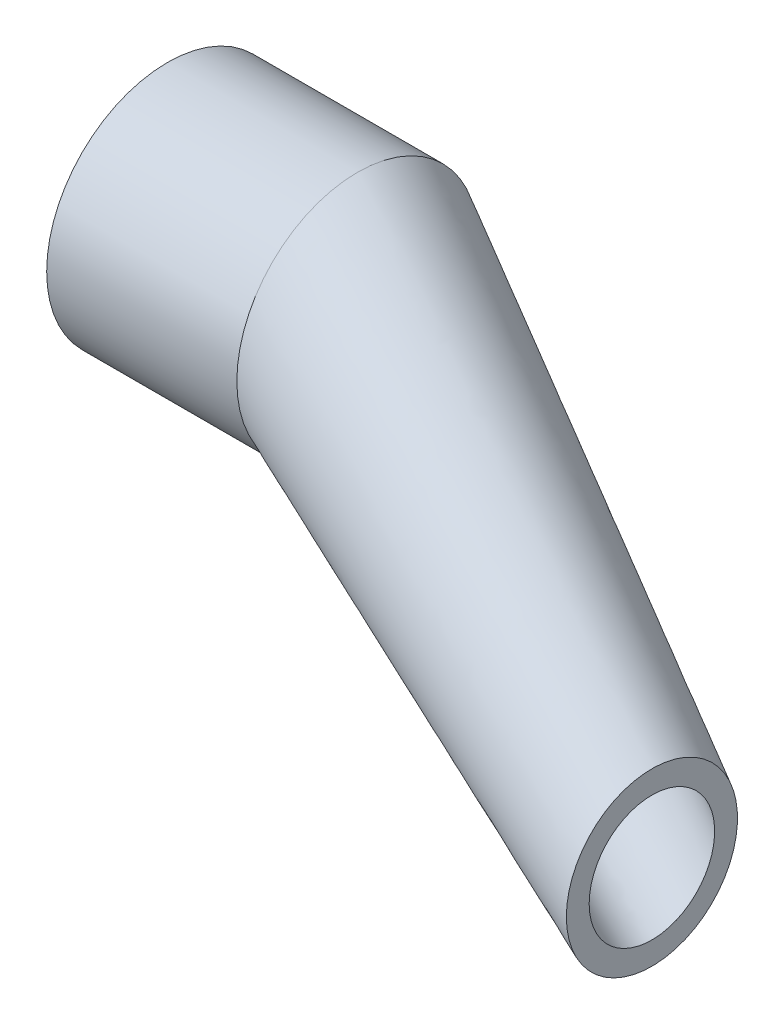
ISO-10303-21;
HEADER;
FILE_DESCRIPTION(('STEP AP214'),'2;1');
FILE_NAME('part.step','',(''),(''),'','','');
FILE_SCHEMA(('AUTOMOTIVE_DESIGN { 1 0 10303 214 1 1 1 1 }'));
ENDSEC;
DATA;
#1=APPLICATION_CONTEXT('core data for automotive mechanical design processes');
#2=APPLICATION_PROTOCOL_DEFINITION('international standard','automotive_design',2000,#1);
#3=PRODUCT_CONTEXT('',#1,'mechanical');
#4=PRODUCT('Part','Part','',(#3));
#5=PRODUCT_RELATED_PRODUCT_CATEGORY('part','',(#4));
#6=PRODUCT_DEFINITION_FORMATION('','',#4);
#7=PRODUCT_DEFINITION_CONTEXT('part definition',#1,'design');
#8=PRODUCT_DEFINITION('design','',#6,#7);
#9=PRODUCT_DEFINITION_SHAPE('','',#8);
#10=(LENGTH_UNIT() NAMED_UNIT(*) SI_UNIT(.MILLI.,.METRE.));
#11=(NAMED_UNIT(*) PLANE_ANGLE_UNIT() SI_UNIT($,.RADIAN.));
#12=(NAMED_UNIT(*) SI_UNIT($,.STERADIAN.) SOLID_ANGLE_UNIT());
#13=UNCERTAINTY_MEASURE_WITH_UNIT(LENGTH_MEASURE(1.E-05),#10,'distance_accuracy_value','');
#14=(GEOMETRIC_REPRESENTATION_CONTEXT(3) GLOBAL_UNCERTAINTY_ASSIGNED_CONTEXT((#13)) GLOBAL_UNIT_ASSIGNED_CONTEXT((#10,
#11,#12)) REPRESENTATION_CONTEXT('',''));
#15=CARTESIAN_POINT('',(0.,0.,0.));
#16=DIRECTION('',(0.,0.,1.));
#17=DIRECTION('',(1.,0.,0.));
#18=AXIS2_PLACEMENT_3D('',#15,#16,#17);
#19=CARTESIAN_POINT('',(104.,14.677159484003,-2.583070286594));
#20=CARTESIAN_POINT('',(118.7,12.848733704041,3.627382664695));
#21=CARTESIAN_POINT('',(103.99999999999,13.517186811906,-2.583070286594));
#22=CARTESIAN_POINT('',(118.69999999999,12.051252491976,3.627382664695));
#23=CARTESIAN_POINT('',(104.00000000003,12.357213675965,-3.190433890196));
#24=CARTESIAN_POINT('',(118.70000000004,11.25377096101,3.209820187222));
#25=CARTESIAN_POINT('',(103.99999999989,11.544169245745,-4.405124938168));
#26=CARTESIAN_POINT('',(118.69999999988,10.694802915252,2.374720091732));
#27=CARTESIAN_POINT('',(104.00000000019,11.424939657342,-6.009361118567));
#28=CARTESIAN_POINT('',(118.70000000023,10.612832573184,1.271807717726));
#29=CARTESIAN_POINT('',(103.99999999972,12.194434662155,-7.566481268748));
#30=CARTESIAN_POINT('',(118.69999999967,11.141860389064,0.201287614448));
#31=CARTESIAN_POINT('',(104.00000000029,13.742485070248,-8.5439502377));
#32=CARTESIAN_POINT('',(118.70000000034,12.206145044529,-0.470722301671));
#33=CARTESIAN_POINT('',(103.99999999976,15.611833897766,-8.54395023766));
#34=CARTESIAN_POINT('',(118.69999999972,13.49132236356,-0.470722301677));
#35=CARTESIAN_POINT('',(104.00000000014,17.159884305833,-7.56648126878));
#36=CARTESIAN_POINT('',(118.70000000015,14.555607019002,0.201287614452));
#37=CARTESIAN_POINT('',(103.99999999993,17.929379310682,-6.009361118547));
#38=CARTESIAN_POINT('',(118.69999999993,15.084634834914,1.271807717724));
#39=CARTESIAN_POINT('',(104.00000000002,17.810149722251,-4.405124938177));
#40=CARTESIAN_POINT('',(118.70000000001,15.00266449282,2.374720091734));
#41=CARTESIAN_POINT('',(103.99999999999,16.997105292046,-3.190433890192));
#42=CARTESIAN_POINT('',(118.69999999999,14.443696447076,3.209820187221));
#43=CARTESIAN_POINT('',(104.,15.837132156098,-2.583070286594));
#44=CARTESIAN_POINT('',(118.7,13.646214916105,3.627382664695));
#45=CARTESIAN_POINT('',(104.,14.677159484003,-2.583070286594));
#46=CARTESIAN_POINT('',(118.7,12.848733704041,3.627382664695));
#47=(BOUNDED_SURFACE() B_SPLINE_SURFACE(13,1,((#19,#20),(#21,#22),(#23,#24),(#25,#26),(#27,#28),
(#29,#30),(#31,#32),(#33,#34),(#35,#36),(#37,#38),(#39,#40),(#41,#42),(#43,#44),(#45,#46)),
.UNSPECIFIED.,.T.,.F.,.F.) B_SPLINE_SURFACE_WITH_KNOTS((14,14),(2,2),(0.,6.28318530718),(0.,1.),
.UNSPECIFIED.) GEOMETRIC_REPRESENTATION_ITEM() RATIONAL_B_SPLINE_SURFACE(((1.,1.),(1.,1.),(1.,
1.),(1.,1.),(1.,1.),(1.,1.),(1.,1.),(1.,1.),(1.,1.),(1.,1.),(1.,1.),(1.,1.),(1.,1.),(1.,1.))) REPRESENTATION_ITEM('') SURFACE());
#48=CARTESIAN_POINT('',(104.,14.677159484003,-2.583070286594));
#49=CARTESIAN_POINT('',(118.7,12.848733704041,3.627382664695));
#50=(BOUNDED_CURVE() B_SPLINE_CURVE(1,(#48,#49),.UNSPECIFIED.,.F.,
.F.) B_SPLINE_CURVE_WITH_KNOTS((2,2),(0.,1.),
.UNSPECIFIED.) CURVE() GEOMETRIC_REPRESENTATION_ITEM() RATIONAL_B_SPLINE_CURVE((1.,1.)) REPRESENTATION_ITEM(''));
#51=CARTESIAN_POINT('',(104.,14.677159484003,-2.583070286594));
#52=VERTEX_POINT('',#51);
#53=CARTESIAN_POINT('',(118.7,12.848733704041,3.627382664695));
#54=VERTEX_POINT('',#53);
#55=EDGE_CURVE('E11',#52,#54,#50,.T.);
#56=CARTESIAN_POINT('',(118.7,12.848733704041,1.977382664695));
#57=DIRECTION('',(1.,0.,0.));
#58=DIRECTION('',(0.,0.,1.));
#59=AXIS2_PLACEMENT_3D('',#56,#57,#58);
#60=CIRCLE('',#59,1.65);
#61=EDGE_CURVE('E31',#54,#54,#60,.T.);
#62=CARTESIAN_POINT('',(104.,14.677159484003,-4.983070286594));
#63=DIRECTION('',(1.,0.,0.));
#64=DIRECTION('',(0.,0.,1.));
#65=AXIS2_PLACEMENT_3D('',#62,#63,#64);
#66=CIRCLE('',#65,2.4);
#67=EDGE_CURVE('E169',#52,#52,#66,.T.);
#68=ORIENTED_EDGE('',*,*,#55,.T.);
#69=ORIENTED_EDGE('',*,*,#61,.T.);
#70=ORIENTED_EDGE('',*,*,#55,.F.);
#71=ORIENTED_EDGE('',*,*,#67,.F.);
#72=EDGE_LOOP('',(#68,#69,#70,#71));
#73=FACE_BOUND('',#72,.T.);
#74=ADVANCED_FACE('F17',(#73),#47,.F.);
#75=CARTESIAN_POINT('',(118.7,12.848733704041,1.977382664695));
#76=DIRECTION('',(1.,0.,0.));
#77=DIRECTION('',(0.,1.,0.));
#78=AXIS2_PLACEMENT_3D('',#75,#76,#77);
#79=PLANE('',#78);
#80=ORIENTED_EDGE('',*,*,#61,.F.);
#81=EDGE_LOOP('',(#80));
#82=FACE_BOUND('',#81,.T.);
#83=CARTESIAN_POINT('',(118.7,12.848733704041,1.977382664695));
#84=DIRECTION('',(1.,0.,0.));
#85=DIRECTION('',(0.,0.,1.));
#86=AXIS2_PLACEMENT_3D('',#83,#84,#85);
#87=CIRCLE('',#86,2.25);
#88=CARTESIAN_POINT('',(118.7,12.848733704041,4.227382664695));
#89=VERTEX_POINT('',#88);
#90=EDGE_CURVE('E71',#89,#89,#87,.T.);
#91=ORIENTED_EDGE('',*,*,#90,.T.);
#92=EDGE_LOOP('',(#91));
#93=FACE_BOUND('',#92,.T.);
#94=ADVANCED_FACE('F115',(#82,#93),#79,.T.);
#95=CARTESIAN_POINT('',(99.,14.677159484003,-4.983070286594));
#96=DIRECTION('',(1.,0.,0.));
#97=DIRECTION('',(0.,0.,1.));
#98=AXIS2_PLACEMENT_3D('',#95,#96,#97);
#99=CYLINDRICAL_SURFACE('',#98,2.4);
#100=CARTESIAN_POINT('',(99.,14.677159484003,-2.583070286594));
#101=CARTESIAN_POINT('',(104.,14.677159484003,-2.583070286594));
#102=(BOUNDED_CURVE() B_SPLINE_CURVE(1,(#100,#101),.UNSPECIFIED.,.F.,
.F.) B_SPLINE_CURVE_WITH_KNOTS((2,2),(0.,1.),
.UNSPECIFIED.) CURVE() GEOMETRIC_REPRESENTATION_ITEM() RATIONAL_B_SPLINE_CURVE((1.,1.)) REPRESENTATION_ITEM(''));
#103=CARTESIAN_POINT('',(99.,14.677159484003,-2.583070286594));
#104=VERTEX_POINT('',#103);
#105=EDGE_CURVE('E22',#104,#52,#102,.T.);
#106=ORIENTED_EDGE('',*,*,#105,.T.);
#107=ORIENTED_EDGE('',*,*,#67,.T.);
#108=ORIENTED_EDGE('',*,*,#105,.F.);
#109=CARTESIAN_POINT('',(99.,14.677159484003,-4.983070286594));
#110=DIRECTION('',(1.,0.,0.));
#111=DIRECTION('',(0.,0.,1.));
#112=AXIS2_PLACEMENT_3D('',#109,#110,#111);
#113=CIRCLE('',#112,2.4);
#114=EDGE_CURVE('E73',#104,#104,#113,.T.);
#115=ORIENTED_EDGE('',*,*,#114,.F.);
#116=EDGE_LOOP('',(#106,#107,#108,#115));
#117=FACE_BOUND('',#116,.T.);
#118=ADVANCED_FACE('F112',(#117),#99,.F.);
#119=CARTESIAN_POINT('',(104.,14.677159484003,-1.808070286594));
#120=CARTESIAN_POINT('',(118.7,12.848733704041,4.227382664695));
#121=CARTESIAN_POINT('',(103.99999999999,13.142612303208,-1.808070286594));
#122=CARTESIAN_POINT('',(118.69999999999,11.761259323953,4.227382664695));
#123=CARTESIAN_POINT('',(104.00000000003,11.608064508787,-2.611561720522));
#124=CARTESIAN_POINT('',(118.70000000004,10.673784508997,3.657979286322));
#125=CARTESIAN_POINT('',(103.99999999989,10.532474481304,-4.218496752748));
#126=CARTESIAN_POINT('',(118.69999999988,9.911555355698,2.519206428839));
#127=CARTESIAN_POINT('',(104.00000000019,10.374743671656,-6.340767533039));
#128=CARTESIAN_POINT('',(118.70000000023,9.799777616499,1.015235009733));
#129=CARTESIAN_POINT('',(103.99999999972,11.392721438423,-8.400707731764));
#130=CARTESIAN_POINT('',(118.69999999967,10.521179183633,-0.44456513109));
#131=CARTESIAN_POINT('',(104.00000000029,13.440663124155,-9.693817721875));
#132=CARTESIAN_POINT('',(118.70000000034,11.972476441053,-1.360942289449));
#133=CARTESIAN_POINT('',(103.99999999976,15.913655843859,-9.693817721894));
#134=CARTESIAN_POINT('',(118.69999999972,13.724990967037,-1.360942289441));
#135=CARTESIAN_POINT('',(104.00000000014,17.961597529566,-8.400707731748));
#136=CARTESIAN_POINT('',(118.70000000015,15.17628822443,-0.444565131096));
#137=CARTESIAN_POINT('',(103.99999999993,18.979575296367,-6.34076753305));
#138=CARTESIAN_POINT('',(118.69999999993,15.897689791603,1.015235009738));
#139=CARTESIAN_POINT('',(104.00000000002,18.821844486692,-4.218496752742));
#140=CARTESIAN_POINT('',(118.70000000001,15.785912052372,2.519206428837));
#141=CARTESIAN_POINT('',(103.99999999999,17.746254459223,-2.611561720524));
#142=CARTESIAN_POINT('',(118.69999999999,15.023682899091,3.657979286322));
#143=CARTESIAN_POINT('',(104.,16.211706664797,-1.808070286594));
#144=CARTESIAN_POINT('',(118.7,13.936208084128,4.227382664695));
#145=CARTESIAN_POINT('',(104.,14.677159484003,-1.808070286594));
#146=CARTESIAN_POINT('',(118.7,12.848733704041,4.227382664695));
#147=(BOUNDED_SURFACE() B_SPLINE_SURFACE(13,1,((#119,#120),(#121,#122),(#123,#124),(#125,#126),
(#127,#128),(#129,#130),(#131,#132),(#133,#134),(#135,#136),(#137,#138),(#139,#140),(#141,#142),
(#143,#144),(#145,#146)),.UNSPECIFIED.,.T.,.F.,.F.) B_SPLINE_SURFACE_WITH_KNOTS((14,14),(2,2),
(0.,6.28318530718),(0.,1.),
.UNSPECIFIED.) GEOMETRIC_REPRESENTATION_ITEM() RATIONAL_B_SPLINE_SURFACE(((1.,1.),(1.,1.),(1.,
1.),(1.,1.),(1.,1.),(1.,1.),(1.,1.),(1.,1.),(1.,1.),(1.,1.),(1.,1.),(1.,1.),(1.,1.),(1.,1.))) REPRESENTATION_ITEM('') SURFACE());
#148=CARTESIAN_POINT('',(104.,14.677159484003,-4.983070286594));
#149=DIRECTION('',(1.,0.,0.));
#150=DIRECTION('',(0.,0.,1.));
#151=AXIS2_PLACEMENT_3D('',#148,#149,#150);
#152=CIRCLE('',#151,3.175);
#153=CARTESIAN_POINT('',(104.,14.677159484003,-1.808070286594));
#154=VERTEX_POINT('',#153);
#155=EDGE_CURVE('E69',#154,#154,#152,.T.);
#156=CARTESIAN_POINT('',(104.,14.677159484003,-1.808070286594));
#157=CARTESIAN_POINT('',(118.7,12.848733704041,4.227382664695));
#158=(BOUNDED_CURVE() B_SPLINE_CURVE(1,(#156,#157),.UNSPECIFIED.,.F.,
.F.) B_SPLINE_CURVE_WITH_KNOTS((2,2),(0.,1.),
.UNSPECIFIED.) CURVE() GEOMETRIC_REPRESENTATION_ITEM() RATIONAL_B_SPLINE_CURVE((1.,1.)) REPRESENTATION_ITEM(''));
#159=EDGE_CURVE('E67',#154,#89,#158,.T.);
#160=ORIENTED_EDGE('',*,*,#155,.T.);
#161=ORIENTED_EDGE('',*,*,#159,.T.);
#162=ORIENTED_EDGE('',*,*,#90,.F.);
#163=ORIENTED_EDGE('',*,*,#159,.F.);
#164=EDGE_LOOP('',(#160,#161,#162,#163));
#165=FACE_BOUND('',#164,.T.);
#166=ADVANCED_FACE('F68',(#165),#147,.T.);
#167=CARTESIAN_POINT('',(99.,14.677159484003,-4.983070286594));
#168=DIRECTION('',(1.,0.,0.));
#169=DIRECTION('',(0.,1.,0.));
#170=AXIS2_PLACEMENT_3D('',#167,#168,#169);
#171=PLANE('',#170);
#172=ORIENTED_EDGE('',*,*,#114,.T.);
#173=EDGE_LOOP('',(#172));
#174=FACE_BOUND('',#173,.T.);
#175=CARTESIAN_POINT('',(99.,14.677159484003,-4.983070286594));
#176=DIRECTION('',(1.,0.,0.));
#177=DIRECTION('',(0.,0.,1.));
#178=AXIS2_PLACEMENT_3D('',#175,#176,#177);
#179=CIRCLE('',#178,3.175);
#180=CARTESIAN_POINT('',(99.,14.677159484003,-1.808070286594));
#181=VERTEX_POINT('',#180);
#182=EDGE_CURVE('E84',#181,#181,#179,.T.);
#183=ORIENTED_EDGE('',*,*,#182,.F.);
#184=EDGE_LOOP('',(#183));
#185=FACE_BOUND('',#184,.T.);
#186=ADVANCED_FACE('F102',(#174,#185),#171,.F.);
#187=CARTESIAN_POINT('',(99.,14.677159484003,-4.983070286594));
#188=DIRECTION('',(1.,0.,0.));
#189=DIRECTION('',(0.,0.,1.));
#190=AXIS2_PLACEMENT_3D('',#187,#188,#189);
#191=CYLINDRICAL_SURFACE('',#190,3.175);
#192=ORIENTED_EDGE('',*,*,#182,.T.);
#193=CARTESIAN_POINT('',(99.,14.677159484003,-1.808070286594));
#194=CARTESIAN_POINT('',(104.,14.677159484003,-1.808070286594));
#195=(BOUNDED_CURVE() B_SPLINE_CURVE(1,(#193,#194),.UNSPECIFIED.,.F.,
.F.) B_SPLINE_CURVE_WITH_KNOTS((2,2),(0.,1.),
.UNSPECIFIED.) CURVE() GEOMETRIC_REPRESENTATION_ITEM() RATIONAL_B_SPLINE_CURVE((1.,1.)) REPRESENTATION_ITEM(''));
#196=EDGE_CURVE('E59',#181,#154,#195,.T.);
#197=ORIENTED_EDGE('',*,*,#196,.T.);
#198=ORIENTED_EDGE('',*,*,#155,.F.);
#199=ORIENTED_EDGE('',*,*,#196,.F.);
#200=EDGE_LOOP('',(#192,#197,#198,#199));
#201=FACE_BOUND('',#200,.T.);
#202=ADVANCED_FACE('F100',(#201),#191,.T.);
#203=CLOSED_SHELL('',(#74,#94,#118,#166,#186,#202));
#204=MANIFOLD_SOLID_BREP('B1',#203);
#205=ADVANCED_BREP_SHAPE_REPRESENTATION('',(#18,#204),#14);
#206=SHAPE_DEFINITION_REPRESENTATION(#9,#205);
ENDSEC;
END-ISO-10303-21;
